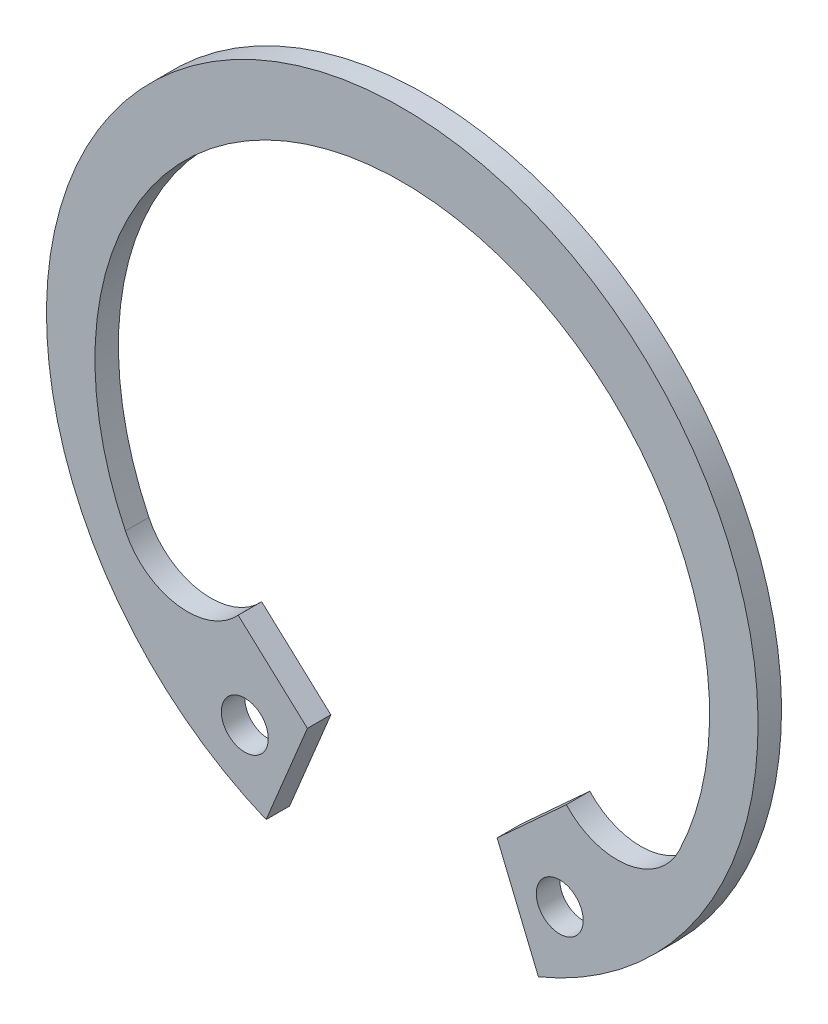
ISO-10303-21;
HEADER;
FILE_DESCRIPTION(('STEP AP214'),'2;1');
FILE_NAME('part.step','',(''),(''),'','','');
FILE_SCHEMA(('AUTOMOTIVE_DESIGN { 1 0 10303 214 1 1 1 1 }'));
ENDSEC;
DATA;
#1=APPLICATION_CONTEXT('core data for automotive mechanical design processes');
#2=APPLICATION_PROTOCOL_DEFINITION('international standard','automotive_design',2000,#1);
#3=PRODUCT_CONTEXT('',#1,'mechanical');
#4=PRODUCT('Part','Part','',(#3));
#5=PRODUCT_RELATED_PRODUCT_CATEGORY('part','',(#4));
#6=PRODUCT_DEFINITION_FORMATION('','',#4);
#7=PRODUCT_DEFINITION_CONTEXT('part definition',#1,'design');
#8=PRODUCT_DEFINITION('design','',#6,#7);
#9=PRODUCT_DEFINITION_SHAPE('','',#8);
#10=(LENGTH_UNIT() NAMED_UNIT(*) SI_UNIT(.MILLI.,.METRE.));
#11=(NAMED_UNIT(*) PLANE_ANGLE_UNIT() SI_UNIT($,.RADIAN.));
#12=(NAMED_UNIT(*) SI_UNIT($,.STERADIAN.) SOLID_ANGLE_UNIT());
#13=UNCERTAINTY_MEASURE_WITH_UNIT(LENGTH_MEASURE(1.E-05),#10,'distance_accuracy_value','');
#14=(GEOMETRIC_REPRESENTATION_CONTEXT(3) GLOBAL_UNCERTAINTY_ASSIGNED_CONTEXT((#13)) GLOBAL_UNIT_ASSIGNED_CONTEXT((#10,
#11,#12)) REPRESENTATION_CONTEXT('',''));
#15=CARTESIAN_POINT('',(0.,0.,0.));
#16=DIRECTION('',(0.,0.,1.));
#17=DIRECTION('',(1.,0.,0.));
#18=AXIS2_PLACEMENT_3D('',#15,#16,#17);
#19=CARTESIAN_POINT('',(0.,0.,0.75));
#20=DIRECTION('',(0.,0.,1.));
#21=DIRECTION('',(1.,0.,0.));
#22=AXIS2_PLACEMENT_3D('',#19,#20,#21);
#23=PLANE('',#22);
#24=CARTESIAN_POINT('',(-10.0676565562048,-16.4660952100462,0.75));
#25=DIRECTION('',(0.,0.,1.));
#26=DIRECTION('',(1.,0.,0.));
#27=AXIS2_PLACEMENT_3D('',#24,#25,#26);
#28=CIRCLE('',#27,1.5);
#29=CARTESIAN_POINT('',(-8.56765655620483,-16.4660952100462,0.75));
#30=VERTEX_POINT('',#29);
#31=EDGE_CURVE('E150',#30,#30,#28,.T.);
#32=ORIENTED_EDGE('',*,*,#31,.F.);
#33=EDGE_LOOP('',(#32));
#34=FACE_BOUND('',#33,.T.);
#35=CARTESIAN_POINT('',(0.,0.,0.75));
#36=DIRECTION('',(0.,0.,1.));
#37=DIRECTION('',(1.,0.,0.));
#38=AXIS2_PLACEMENT_3D('',#35,#36,#37);
#39=CIRCLE('',#38,22.75);
#40=CARTESIAN_POINT('',(8.70604808630565,-21.0182593646318,0.75));
#41=VERTEX_POINT('',#40);
#42=CARTESIAN_POINT('',(-8.70604808630565,-21.0182593646318,0.75));
#43=VERTEX_POINT('',#42);
#44=EDGE_CURVE('E153',#41,#43,#39,.T.);
#45=ORIENTED_EDGE('',*,*,#44,.T.);
#46=DIRECTION('',(0.382683432365084,0.923879532511289,0.));
#47=VECTOR('',#46,1.);
#48=CARTESIAN_POINT('',(-6.06553240298657,-14.6434905903039,0.75));
#49=LINE('',#48,#47);
#50=CARTESIAN_POINT('',(-6.06553240298657,-14.6434905903039,0.75));
#51=VERTEX_POINT('',#50);
#52=EDGE_CURVE('E105',#43,#51,#49,.T.);
#53=ORIENTED_EDGE('',*,*,#52,.T.);
#54=DIRECTION('',(-0.737671578756795,0.675159715840969,0.));
#55=VECTOR('',#54,1.);
#56=CARTESIAN_POINT('',(-10.4915618755273,-10.5925322952581,0.75));
#57=LINE('',#56,#55);
#58=CARTESIAN_POINT('',(-10.4915618755273,-10.5925322952581,0.75));
#59=VERTEX_POINT('',#58);
#60=EDGE_CURVE('E157',#51,#59,#57,.T.);
#61=ORIENTED_EDGE('',*,*,#60,.T.);
#62=CARTESIAN_POINT('',(-13.7373168220572,-7.62182954555786,0.75));
#63=DIRECTION('',(0.,0.,-1.));
#64=DIRECTION('',(1.,0.,0.));
#65=AXIS2_PLACEMENT_3D('',#62,#63,#64);
#66=CIRCLE('',#65,4.4);
#67=CARTESIAN_POINT('',(-17.7008705280934,-9.53239020132538,0.75));
#68=VERTEX_POINT('',#67);
#69=EDGE_CURVE('E159',#59,#68,#66,.T.);
#70=ORIENTED_EDGE('',*,*,#69,.T.);
#71=CARTESIAN_POINT('',(0.,-1.,0.75));
#72=DIRECTION('',(0.,0.,-1.));
#73=DIRECTION('',(1.,0.,0.));
#74=AXIS2_PLACEMENT_3D('',#71,#72,#73);
#75=CIRCLE('',#74,19.65);
#76=CARTESIAN_POINT('',(17.7008705280934,-9.53239020132538,0.75));
#77=VERTEX_POINT('',#76);
#78=EDGE_CURVE('E161',#68,#77,#75,.T.);
#79=ORIENTED_EDGE('',*,*,#78,.T.);
#80=CARTESIAN_POINT('',(13.7373168220572,-7.62182954555786,0.75));
#81=DIRECTION('',(0.,0.,-1.));
#82=DIRECTION('',(-1.,0.,0.));
#83=AXIS2_PLACEMENT_3D('',#80,#81,#82);
#84=CIRCLE('',#83,4.4);
#85=CARTESIAN_POINT('',(10.4915618755273,-10.5925322952581,0.75));
#86=VERTEX_POINT('',#85);
#87=EDGE_CURVE('E163',#77,#86,#84,.T.);
#88=ORIENTED_EDGE('',*,*,#87,.T.);
#89=DIRECTION('',(-0.737671578756795,-0.675159715840969,0.));
#90=VECTOR('',#89,1.);
#91=CARTESIAN_POINT('',(10.4915618755273,-10.5925322952581,0.75));
#92=LINE('',#91,#90);
#93=CARTESIAN_POINT('',(6.06553240298657,-14.6434905903039,0.75));
#94=VERTEX_POINT('',#93);
#95=EDGE_CURVE('E57',#86,#94,#92,.T.);
#96=ORIENTED_EDGE('',*,*,#95,.T.);
#97=DIRECTION('',(0.382683432365084,-0.923879532511289,0.));
#98=VECTOR('',#97,1.);
#99=CARTESIAN_POINT('',(6.06553240298657,-14.6434905903039,0.75));
#100=LINE('',#99,#98);
#101=EDGE_CURVE('E52',#94,#41,#100,.T.);
#102=ORIENTED_EDGE('',*,*,#101,.T.);
#103=EDGE_LOOP('',(#45,#53,#61,#70,#79,#88,#96,#102));
#104=FACE_BOUND('',#103,.T.);
#105=CARTESIAN_POINT('',(10.0676565562048,-16.4660952100462,0.75));
#106=DIRECTION('',(0.,0.,1.));
#107=DIRECTION('',(-1.,0.,0.));
#108=AXIS2_PLACEMENT_3D('',#105,#106,#107);
#109=CIRCLE('',#108,1.5);
#110=CARTESIAN_POINT('',(8.56765655620483,-16.4660952100462,0.75));
#111=VERTEX_POINT('',#110);
#112=EDGE_CURVE('E147',#111,#111,#109,.T.);
#113=ORIENTED_EDGE('',*,*,#112,.F.);
#114=EDGE_LOOP('',(#113));
#115=FACE_BOUND('',#114,.T.);
#116=ADVANCED_FACE('F37',(#34,#104,#115),#23,.T.);
#117=CARTESIAN_POINT('',(0.,0.,0.75));
#118=DIRECTION('',(0.,0.,-1.));
#119=DIRECTION('',(-1.,0.,0.));
#120=AXIS2_PLACEMENT_3D('',#117,#118,#119);
#121=CYLINDRICAL_SURFACE('',#120,22.75);
#122=DIRECTION('',(0.,0.,-1.));
#123=VECTOR('',#122,1.);
#124=CARTESIAN_POINT('',(8.70604808630565,-21.0182593646318,0.75));
#125=LINE('',#124,#123);
#126=CARTESIAN_POINT('',(8.70604808630565,-21.0182593646318,-0.75));
#127=VERTEX_POINT('',#126);
#128=EDGE_CURVE('E120',#41,#127,#125,.T.);
#129=ORIENTED_EDGE('',*,*,#128,.T.);
#130=CARTESIAN_POINT('',(0.,0.,-0.75));
#131=DIRECTION('',(0.,0.,1.));
#132=DIRECTION('',(1.,0.,0.));
#133=AXIS2_PLACEMENT_3D('',#130,#131,#132);
#134=CIRCLE('',#133,22.75);
#135=CARTESIAN_POINT('',(-8.70604808630565,-21.0182593646318,-0.75));
#136=VERTEX_POINT('',#135);
#137=EDGE_CURVE('E114',#127,#136,#134,.T.);
#138=ORIENTED_EDGE('',*,*,#137,.T.);
#139=DIRECTION('',(0.,0.,-1.));
#140=VECTOR('',#139,1.);
#141=CARTESIAN_POINT('',(-8.70604808630565,-21.0182593646318,0.75));
#142=LINE('',#141,#140);
#143=EDGE_CURVE('E11',#43,#136,#142,.T.);
#144=ORIENTED_EDGE('',*,*,#143,.F.);
#145=ORIENTED_EDGE('',*,*,#44,.F.);
#146=EDGE_LOOP('',(#129,#138,#144,#145));
#147=FACE_BOUND('',#146,.T.);
#148=ADVANCED_FACE('F39',(#147),#121,.T.);
#149=CARTESIAN_POINT('',(-6.06553240298657,-14.6434905903039,0.75));
#150=DIRECTION('',(-0.923879532511289,0.382683432365084,0.));
#151=DIRECTION('',(-0.382683432365084,-0.923879532511289,0.));
#152=AXIS2_PLACEMENT_3D('',#149,#150,#151);
#153=PLANE('',#152);
#154=ORIENTED_EDGE('',*,*,#143,.T.);
#155=DIRECTION('',(0.382683432365084,0.923879532511289,0.));
#156=VECTOR('',#155,1.);
#157=CARTESIAN_POINT('',(-6.06553240298657,-14.6434905903039,-0.75));
#158=LINE('',#157,#156);
#159=CARTESIAN_POINT('',(-6.06553240298657,-14.6434905903039,-0.75));
#160=VERTEX_POINT('',#159);
#161=EDGE_CURVE('E104',#136,#160,#158,.T.);
#162=ORIENTED_EDGE('',*,*,#161,.T.);
#163=DIRECTION('',(0.,0.,-1.));
#164=VECTOR('',#163,1.);
#165=CARTESIAN_POINT('',(-6.06553240298657,-14.6434905903039,0.75));
#166=LINE('',#165,#164);
#167=EDGE_CURVE('E45',#51,#160,#166,.T.);
#168=ORIENTED_EDGE('',*,*,#167,.F.);
#169=ORIENTED_EDGE('',*,*,#52,.F.);
#170=EDGE_LOOP('',(#154,#162,#168,#169));
#171=FACE_BOUND('',#170,.T.);
#172=ADVANCED_FACE('F102',(#171),#153,.F.);
#173=CARTESIAN_POINT('',(-10.4915618755273,-10.5925322952581,0.75));
#174=DIRECTION('',(-0.675159715840969,-0.737671578756795,0.));
#175=DIRECTION('',(0.737671578756795,-0.675159715840969,0.));
#176=AXIS2_PLACEMENT_3D('',#173,#174,#175);
#177=PLANE('',#176);
#178=ORIENTED_EDGE('',*,*,#167,.T.);
#179=DIRECTION('',(-0.737671578756795,0.675159715840969,0.));
#180=VECTOR('',#179,1.);
#181=CARTESIAN_POINT('',(-10.4915618755273,-10.5925322952581,-0.75));
#182=LINE('',#181,#180);
#183=CARTESIAN_POINT('',(-10.4915618755273,-10.5925322952581,-0.75));
#184=VERTEX_POINT('',#183);
#185=EDGE_CURVE('E118',#160,#184,#182,.T.);
#186=ORIENTED_EDGE('',*,*,#185,.T.);
#187=DIRECTION('',(0.,0.,-1.));
#188=VECTOR('',#187,1.);
#189=CARTESIAN_POINT('',(-10.4915618755273,-10.5925322952581,0.75));
#190=LINE('',#189,#188);
#191=EDGE_CURVE('E176',#59,#184,#190,.T.);
#192=ORIENTED_EDGE('',*,*,#191,.F.);
#193=ORIENTED_EDGE('',*,*,#60,.F.);
#194=EDGE_LOOP('',(#178,#186,#192,#193));
#195=FACE_BOUND('',#194,.T.);
#196=ADVANCED_FACE('F179',(#195),#177,.F.);
#197=CARTESIAN_POINT('',(-13.7373168220572,-7.62182954555786,0.75));
#198=DIRECTION('',(0.,0.,-1.));
#199=DIRECTION('',(-1.,0.,0.));
#200=AXIS2_PLACEMENT_3D('',#197,#198,#199);
#201=CYLINDRICAL_SURFACE('',#200,4.4);
#202=ORIENTED_EDGE('',*,*,#191,.T.);
#203=CARTESIAN_POINT('',(-13.7373168220572,-7.62182954555786,-0.75));
#204=DIRECTION('',(0.,0.,-1.));
#205=DIRECTION('',(1.,0.,0.));
#206=AXIS2_PLACEMENT_3D('',#203,#204,#205);
#207=CIRCLE('',#206,4.4);
#208=CARTESIAN_POINT('',(-17.7008705280934,-9.53239020132538,-0.75));
#209=VERTEX_POINT('',#208);
#210=EDGE_CURVE('E133',#184,#209,#207,.T.);
#211=ORIENTED_EDGE('',*,*,#210,.T.);
#212=DIRECTION('',(0.,0.,-1.));
#213=VECTOR('',#212,1.);
#214=CARTESIAN_POINT('',(-17.7008705280934,-9.53239020132538,0.75));
#215=LINE('',#214,#213);
#216=EDGE_CURVE('E174',#68,#209,#215,.T.);
#217=ORIENTED_EDGE('',*,*,#216,.F.);
#218=ORIENTED_EDGE('',*,*,#69,.F.);
#219=EDGE_LOOP('',(#202,#211,#217,#218));
#220=FACE_BOUND('',#219,.T.);
#221=ADVANCED_FACE('F187',(#220),#201,.F.);
#222=CARTESIAN_POINT('',(0.,-1.,0.75));
#223=DIRECTION('',(0.,0.,-1.));
#224=DIRECTION('',(-1.,0.,0.));
#225=AXIS2_PLACEMENT_3D('',#222,#223,#224);
#226=CYLINDRICAL_SURFACE('',#225,19.65);
#227=ORIENTED_EDGE('',*,*,#216,.T.);
#228=CARTESIAN_POINT('',(0.,-1.,-0.75));
#229=DIRECTION('',(0.,0.,-1.));
#230=DIRECTION('',(1.,0.,0.));
#231=AXIS2_PLACEMENT_3D('',#228,#229,#230);
#232=CIRCLE('',#231,19.65);
#233=CARTESIAN_POINT('',(17.7008705280934,-9.53239020132538,-0.75));
#234=VERTEX_POINT('',#233);
#235=EDGE_CURVE('E136',#209,#234,#232,.T.);
#236=ORIENTED_EDGE('',*,*,#235,.T.);
#237=DIRECTION('',(0.,0.,-1.));
#238=VECTOR('',#237,1.);
#239=CARTESIAN_POINT('',(17.7008705280934,-9.53239020132538,0.75));
#240=LINE('',#239,#238);
#241=EDGE_CURVE('E172',#77,#234,#240,.T.);
#242=ORIENTED_EDGE('',*,*,#241,.F.);
#243=ORIENTED_EDGE('',*,*,#78,.F.);
#244=EDGE_LOOP('',(#227,#236,#242,#243));
#245=FACE_BOUND('',#244,.T.);
#246=ADVANCED_FACE('F190',(#245),#226,.F.);
#247=CARTESIAN_POINT('',(13.7373168220572,-7.62182954555786,0.75));
#248=DIRECTION('',(0.,0.,-1.));
#249=DIRECTION('',(-1.,0.,0.));
#250=AXIS2_PLACEMENT_3D('',#247,#248,#249);
#251=CYLINDRICAL_SURFACE('',#250,4.4);
#252=ORIENTED_EDGE('',*,*,#241,.T.);
#253=CARTESIAN_POINT('',(13.7373168220572,-7.62182954555786,-0.75));
#254=DIRECTION('',(0.,0.,-1.));
#255=DIRECTION('',(-1.,0.,0.));
#256=AXIS2_PLACEMENT_3D('',#253,#254,#255);
#257=CIRCLE('',#256,4.4);
#258=CARTESIAN_POINT('',(10.4915618755273,-10.5925322952581,-0.75));
#259=VERTEX_POINT('',#258);
#260=EDGE_CURVE('E139',#234,#259,#257,.T.);
#261=ORIENTED_EDGE('',*,*,#260,.T.);
#262=DIRECTION('',(0.,0.,-1.));
#263=VECTOR('',#262,1.);
#264=CARTESIAN_POINT('',(10.4915618755273,-10.5925322952581,0.75));
#265=LINE('',#264,#263);
#266=EDGE_CURVE('E170',#86,#259,#265,.T.);
#267=ORIENTED_EDGE('',*,*,#266,.F.);
#268=ORIENTED_EDGE('',*,*,#87,.F.);
#269=EDGE_LOOP('',(#252,#261,#267,#268));
#270=FACE_BOUND('',#269,.T.);
#271=ADVANCED_FACE('F195',(#270),#251,.F.);
#272=CARTESIAN_POINT('',(10.4915618755273,-10.5925322952581,0.75));
#273=DIRECTION('',(0.675159715840969,-0.737671578756795,0.));
#274=DIRECTION('',(0.737671578756795,0.675159715840969,0.));
#275=AXIS2_PLACEMENT_3D('',#272,#273,#274);
#276=PLANE('',#275);
#277=ORIENTED_EDGE('',*,*,#266,.T.);
#278=DIRECTION('',(-0.737671578756795,-0.675159715840969,0.));
#279=VECTOR('',#278,1.);
#280=CARTESIAN_POINT('',(10.4915618755273,-10.5925322952581,-0.75));
#281=LINE('',#280,#279);
#282=CARTESIAN_POINT('',(6.06553240298657,-14.6434905903039,-0.75));
#283=VERTEX_POINT('',#282);
#284=EDGE_CURVE('E142',#259,#283,#281,.T.);
#285=ORIENTED_EDGE('',*,*,#284,.T.);
#286=DIRECTION('',(0.,0.,-1.));
#287=VECTOR('',#286,1.);
#288=CARTESIAN_POINT('',(6.06553240298657,-14.6434905903039,0.75));
#289=LINE('',#288,#287);
#290=EDGE_CURVE('E168',#94,#283,#289,.T.);
#291=ORIENTED_EDGE('',*,*,#290,.F.);
#292=ORIENTED_EDGE('',*,*,#95,.F.);
#293=EDGE_LOOP('',(#277,#285,#291,#292));
#294=FACE_BOUND('',#293,.T.);
#295=ADVANCED_FACE('F198',(#294),#276,.F.);
#296=CARTESIAN_POINT('',(6.06553240298657,-14.6434905903039,0.75));
#297=DIRECTION('',(0.923879532511289,0.382683432365084,0.));
#298=DIRECTION('',(-0.382683432365084,0.923879532511289,0.));
#299=AXIS2_PLACEMENT_3D('',#296,#297,#298);
#300=PLANE('',#299);
#301=ORIENTED_EDGE('',*,*,#290,.T.);
#302=DIRECTION('',(0.382683432365084,-0.923879532511289,0.));
#303=VECTOR('',#302,1.);
#304=CARTESIAN_POINT('',(6.06553240298657,-14.6434905903039,-0.75));
#305=LINE('',#304,#303);
#306=EDGE_CURVE('E145',#283,#127,#305,.T.);
#307=ORIENTED_EDGE('',*,*,#306,.T.);
#308=ORIENTED_EDGE('',*,*,#128,.F.);
#309=ORIENTED_EDGE('',*,*,#101,.F.);
#310=EDGE_LOOP('',(#301,#307,#308,#309));
#311=FACE_BOUND('',#310,.T.);
#312=ADVANCED_FACE('F200',(#311),#300,.F.);
#313=CARTESIAN_POINT('',(-10.0676565562048,-16.4660952100462,0.75));
#314=DIRECTION('',(0.,0.,-1.));
#315=DIRECTION('',(-1.,0.,0.));
#316=AXIS2_PLACEMENT_3D('',#313,#314,#315);
#317=CYLINDRICAL_SURFACE('',#316,1.5);
#318=ORIENTED_EDGE('',*,*,#31,.T.);
#319=EDGE_LOOP('',(#318));
#320=FACE_BOUND('',#319,.T.);
#321=CARTESIAN_POINT('',(-10.0676565562048,-16.4660952100462,-0.75));
#322=DIRECTION('',(0.,0.,1.));
#323=DIRECTION('',(1.,0.,0.));
#324=AXIS2_PLACEMENT_3D('',#321,#322,#323);
#325=CIRCLE('',#324,1.5);
#326=CARTESIAN_POINT('',(-8.56765655620483,-16.4660952100462,-0.75));
#327=VERTEX_POINT('',#326);
#328=EDGE_CURVE('E122',#327,#327,#325,.T.);
#329=ORIENTED_EDGE('',*,*,#328,.F.);
#330=EDGE_LOOP('',(#329));
#331=FACE_BOUND('',#330,.T.);
#332=ADVANCED_FACE('F202',(#320,#331),#317,.F.);
#333=CARTESIAN_POINT('',(10.0676565562048,-16.4660952100462,0.75));
#334=DIRECTION('',(0.,0.,-1.));
#335=DIRECTION('',(-1.,0.,0.));
#336=AXIS2_PLACEMENT_3D('',#333,#334,#335);
#337=CYLINDRICAL_SURFACE('',#336,1.5);
#338=ORIENTED_EDGE('',*,*,#112,.T.);
#339=EDGE_LOOP('',(#338));
#340=FACE_BOUND('',#339,.T.);
#341=CARTESIAN_POINT('',(10.0676565562048,-16.4660952100462,-0.75));
#342=DIRECTION('',(0.,0.,1.));
#343=DIRECTION('',(-1.,0.,0.));
#344=AXIS2_PLACEMENT_3D('',#341,#342,#343);
#345=CIRCLE('',#344,1.5);
#346=CARTESIAN_POINT('',(8.56765655620483,-16.4660952100462,-0.75));
#347=VERTEX_POINT('',#346);
#348=EDGE_CURVE('E128',#347,#347,#345,.T.);
#349=ORIENTED_EDGE('',*,*,#348,.F.);
#350=EDGE_LOOP('',(#349));
#351=FACE_BOUND('',#350,.T.);
#352=ADVANCED_FACE('F208',(#340,#351),#337,.F.);
#353=CARTESIAN_POINT('',(0.,0.,-0.75));
#354=DIRECTION('',(0.,0.,1.));
#355=DIRECTION('',(1.,0.,0.));
#356=AXIS2_PLACEMENT_3D('',#353,#354,#355);
#357=PLANE('',#356);
#358=ORIENTED_EDGE('',*,*,#348,.T.);
#359=EDGE_LOOP('',(#358));
#360=FACE_BOUND('',#359,.T.);
#361=ORIENTED_EDGE('',*,*,#328,.T.);
#362=EDGE_LOOP('',(#361));
#363=FACE_BOUND('',#362,.T.);
#364=ORIENTED_EDGE('',*,*,#137,.F.);
#365=ORIENTED_EDGE('',*,*,#306,.F.);
#366=ORIENTED_EDGE('',*,*,#284,.F.);
#367=ORIENTED_EDGE('',*,*,#260,.F.);
#368=ORIENTED_EDGE('',*,*,#235,.F.);
#369=ORIENTED_EDGE('',*,*,#210,.F.);
#370=ORIENTED_EDGE('',*,*,#185,.F.);
#371=ORIENTED_EDGE('',*,*,#161,.F.);
#372=EDGE_LOOP('',(#364,#365,#366,#367,#368,#369,#370,#371));
#373=FACE_BOUND('',#372,.T.);
#374=ADVANCED_FACE('F112',(#360,#363,#373),#357,.F.);
#375=CLOSED_SHELL('',(#116,#148,#172,#196,#221,#246,#271,#295,#312,#332,#352,#374));
#376=MANIFOLD_SOLID_BREP('B2',#375);
#377=ADVANCED_BREP_SHAPE_REPRESENTATION('',(#18,#376),#14);
#378=SHAPE_DEFINITION_REPRESENTATION(#9,#377);
ENDSEC;
END-ISO-10303-21;
